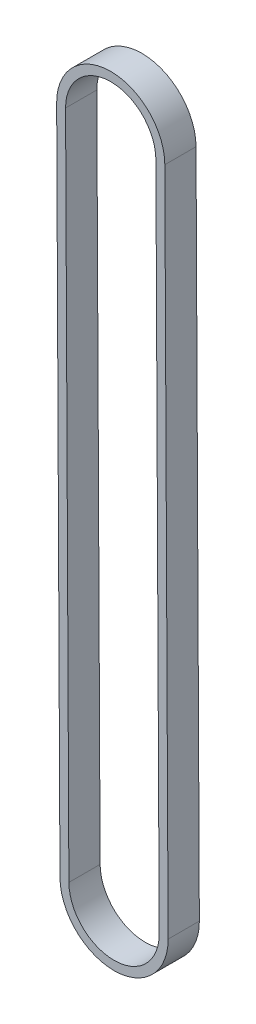
ISO-10303-21;
HEADER;
FILE_DESCRIPTION(('STEP AP214'),'2;1');
FILE_NAME('part.step','',(''),(''),'','','');
FILE_SCHEMA(('AUTOMOTIVE_DESIGN { 1 0 10303 214 1 1 1 1 }'));
ENDSEC;
DATA;
#1=APPLICATION_CONTEXT('core data for automotive mechanical design processes');
#2=APPLICATION_PROTOCOL_DEFINITION('international standard','automotive_design',2000,#1);
#3=PRODUCT_CONTEXT('',#1,'mechanical');
#4=PRODUCT('Part','Part','',(#3));
#5=PRODUCT_RELATED_PRODUCT_CATEGORY('part','',(#4));
#6=PRODUCT_DEFINITION_FORMATION('','',#4);
#7=PRODUCT_DEFINITION_CONTEXT('part definition',#1,'design');
#8=PRODUCT_DEFINITION('design','',#6,#7);
#9=PRODUCT_DEFINITION_SHAPE('','',#8);
#10=(LENGTH_UNIT() NAMED_UNIT(*) SI_UNIT(.MILLI.,.METRE.));
#11=(NAMED_UNIT(*) PLANE_ANGLE_UNIT() SI_UNIT($,.RADIAN.));
#12=(NAMED_UNIT(*) SI_UNIT($,.STERADIAN.) SOLID_ANGLE_UNIT());
#13=UNCERTAINTY_MEASURE_WITH_UNIT(LENGTH_MEASURE(1.E-05),#10,'distance_accuracy_value','');
#14=(GEOMETRIC_REPRESENTATION_CONTEXT(3) GLOBAL_UNCERTAINTY_ASSIGNED_CONTEXT((#13)) GLOBAL_UNIT_ASSIGNED_CONTEXT((#10,
#11,#12)) REPRESENTATION_CONTEXT('',''));
#15=CARTESIAN_POINT('',(0.,0.,0.));
#16=DIRECTION('',(0.,0.,1.));
#17=DIRECTION('',(1.,0.,0.));
#18=AXIS2_PLACEMENT_3D('',#15,#16,#17);
#19=CARTESIAN_POINT('',(-3.01494940124769E-12,0.,3.5));
#20=DIRECTION('',(0.,0.,-1.));
#21=DIRECTION('',(-1.,0.,0.));
#22=AXIS2_PLACEMENT_3D('',#19,#20,#21);
#23=PLANE('',#22);
#24=CARTESIAN_POINT('',(-3.01494940124769E-12,0.,3.5));
#25=DIRECTION('',(0.,0.,-1.));
#26=DIRECTION('',(-1.,0.,0.));
#27=AXIS2_PLACEMENT_3D('',#24,#25,#26);
#28=CIRCLE('',#27,12.125);
#29=CARTESIAN_POINT('',(-12.1248505328568,-0.0602042851909806,3.5));
#30=VERTEX_POINT('',#29);
#31=CARTESIAN_POINT('',(12.1248505328508,0.0602042851910733,3.5));
#32=VERTEX_POINT('',#31);
#33=EDGE_CURVE('E159',#30,#32,#28,.F.);
#34=ORIENTED_EDGE('',*,*,#33,.T.);
#35=DIRECTION('',(-0.00496530187142567,0.999987672812683,0.));
#36=VECTOR('',#35,1.);
#37=CARTESIAN_POINT('',(12.1248505328508,0.0602042851910917,3.5));
#38=LINE('',#37,#36);
#39=CARTESIAN_POINT('',(11.3800552521369,150.058355207094,3.5));
#40=VERTEX_POINT('',#39);
#41=EDGE_CURVE('E162',#32,#40,#38,.T.);
#42=ORIENTED_EDGE('',*,*,#41,.T.);
#43=CARTESIAN_POINT('',(-0.744795280716865,149.998150921903,3.5));
#44=DIRECTION('',(0.,0.,-1.));
#45=DIRECTION('',(-1.,0.,0.));
#46=AXIS2_PLACEMENT_3D('',#43,#44,#45);
#47=CIRCLE('',#46,12.125);
#48=CARTESIAN_POINT('',(-12.8696458135707,149.937946636712,3.5));
#49=VERTEX_POINT('',#48);
#50=EDGE_CURVE('E165',#40,#49,#47,.F.);
#51=ORIENTED_EDGE('',*,*,#50,.T.);
#52=DIRECTION('',(0.00496530187142567,-0.999987672812683,0.));
#53=VECTOR('',#52,1.);
#54=CARTESIAN_POINT('',(-12.1248505328568,-0.0602042851909807,3.5));
#55=LINE('',#54,#53);
#56=EDGE_CURVE('E167',#49,#30,#55,.T.);
#57=ORIENTED_EDGE('',*,*,#56,.T.);
#58=EDGE_LOOP('',(#34,#42,#51,#57));
#59=FACE_BOUND('',#58,.T.);
#60=CARTESIAN_POINT('',(-3.01494940124769E-12,0.,3.5));
#61=DIRECTION('',(0.,0.,1.));
#62=DIRECTION('',(-1.,0.,0.));
#63=AXIS2_PLACEMENT_3D('',#60,#61,#62);
#64=CIRCLE('',#63,10.125);
#65=CARTESIAN_POINT('',(-10.1248751872314,-0.0502736814481293,3.5));
#66=VERTEX_POINT('',#65);
#67=CARTESIAN_POINT('',(10.1248751872254,0.0502736814482403,3.5));
#68=VERTEX_POINT('',#67);
#69=EDGE_CURVE('E123',#66,#68,#64,.T.);
#70=ORIENTED_EDGE('',*,*,#69,.F.);
#71=DIRECTION('',(0.00496530187142567,-0.999987672812683,0.));
#72=VECTOR('',#71,1.);
#73=CARTESIAN_POINT('',(-10.1248751872314,-0.0502736814481293,3.5));
#74=LINE('',#73,#72);
#75=CARTESIAN_POINT('',(-10.8696704679453,149.947877240455,3.5));
#76=VERTEX_POINT('',#75);
#77=EDGE_CURVE('E145',#76,#66,#74,.T.);
#78=ORIENTED_EDGE('',*,*,#77,.F.);
#79=CARTESIAN_POINT('',(-0.744795280716865,149.998150921903,3.5));
#80=DIRECTION('',(0.,0.,1.));
#81=DIRECTION('',(-1.,0.,0.));
#82=AXIS2_PLACEMENT_3D('',#79,#80,#81);
#83=CIRCLE('',#82,10.125);
#84=CARTESIAN_POINT('',(9.38007990651155,150.048424603351,3.5));
#85=VERTEX_POINT('',#84);
#86=EDGE_CURVE('E143',#85,#76,#83,.T.);
#87=ORIENTED_EDGE('',*,*,#86,.F.);
#88=DIRECTION('',(-0.00496530187142567,0.999987672812683,0.));
#89=VECTOR('',#88,1.);
#90=CARTESIAN_POINT('',(9.38007990651155,150.048424603351,3.5));
#91=LINE('',#90,#89);
#92=EDGE_CURVE('E131',#68,#85,#91,.T.);
#93=ORIENTED_EDGE('',*,*,#92,.F.);
#94=EDGE_LOOP('',(#70,#78,#87,#93));
#95=FACE_BOUND('',#94,.T.);
#96=ADVANCED_FACE('F58',(#59,#95),#23,.F.);
#97=CARTESIAN_POINT('',(-3.01494940124769E-12,0.,-3.5));
#98=DIRECTION('',(0.,0.,-1.));
#99=DIRECTION('',(-1.,0.,0.));
#100=AXIS2_PLACEMENT_3D('',#97,#98,#99);
#101=PLANE('',#100);
#102=CARTESIAN_POINT('',(-3.01494940124769E-12,0.,-3.5));
#103=DIRECTION('',(0.,0.,-1.));
#104=DIRECTION('',(-1.,0.,0.));
#105=AXIS2_PLACEMENT_3D('',#102,#103,#104);
#106=CIRCLE('',#105,12.125);
#107=CARTESIAN_POINT('',(-12.1248505328568,-0.0602042851909806,-3.5));
#108=VERTEX_POINT('',#107);
#109=CARTESIAN_POINT('',(12.1248505328508,0.0602042851910733,-3.5));
#110=VERTEX_POINT('',#109);
#111=EDGE_CURVE('E139',#108,#110,#106,.F.);
#112=ORIENTED_EDGE('',*,*,#111,.F.);
#113=DIRECTION('',(0.00496530187142567,-0.999987672812683,0.));
#114=VECTOR('',#113,1.);
#115=CARTESIAN_POINT('',(-12.1248505328568,-0.0602042851909807,-3.5));
#116=LINE('',#115,#114);
#117=CARTESIAN_POINT('',(-12.8696458135707,149.937946636712,-3.5));
#118=VERTEX_POINT('',#117);
#119=EDGE_CURVE('E163',#118,#108,#116,.T.);
#120=ORIENTED_EDGE('',*,*,#119,.F.);
#121=CARTESIAN_POINT('',(-0.744795280716865,149.998150921903,-3.5));
#122=DIRECTION('',(0.,0.,-1.));
#123=DIRECTION('',(-1.,0.,0.));
#124=AXIS2_PLACEMENT_3D('',#121,#122,#123);
#125=CIRCLE('',#124,12.125);
#126=CARTESIAN_POINT('',(11.3800552521369,150.058355207094,-3.5));
#127=VERTEX_POINT('',#126);
#128=EDGE_CURVE('E174',#127,#118,#125,.F.);
#129=ORIENTED_EDGE('',*,*,#128,.F.);
#130=DIRECTION('',(-0.00496530187142567,0.999987672812683,0.));
#131=VECTOR('',#130,1.);
#132=CARTESIAN_POINT('',(12.1248505328508,0.0602042851910917,-3.5));
#133=LINE('',#132,#131);
#134=EDGE_CURVE('E172',#110,#127,#133,.T.);
#135=ORIENTED_EDGE('',*,*,#134,.F.);
#136=EDGE_LOOP('',(#112,#120,#129,#135));
#137=FACE_BOUND('',#136,.T.);
#138=DIRECTION('',(0.00496530187142567,-0.999987672812683,0.));
#139=VECTOR('',#138,1.);
#140=CARTESIAN_POINT('',(-10.1248751872314,-0.0502736814481293,-3.5));
#141=LINE('',#140,#139);
#142=CARTESIAN_POINT('',(-10.8696704679453,149.947877240455,-3.5));
#143=VERTEX_POINT('',#142);
#144=CARTESIAN_POINT('',(-10.1248751872314,-0.0502736814481293,-3.5));
#145=VERTEX_POINT('',#144);
#146=EDGE_CURVE('E132',#143,#145,#141,.T.);
#147=ORIENTED_EDGE('',*,*,#146,.T.);
#148=CARTESIAN_POINT('',(-3.01494940124769E-12,0.,-3.5));
#149=DIRECTION('',(0.,0.,1.));
#150=DIRECTION('',(-1.,0.,0.));
#151=AXIS2_PLACEMENT_3D('',#148,#149,#150);
#152=CIRCLE('',#151,10.125);
#153=CARTESIAN_POINT('',(10.1248751872254,0.0502736814482403,-3.5));
#154=VERTEX_POINT('',#153);
#155=EDGE_CURVE('E81',#145,#154,#152,.T.);
#156=ORIENTED_EDGE('',*,*,#155,.T.);
#157=DIRECTION('',(-0.00496530187142567,0.999987672812683,0.));
#158=VECTOR('',#157,1.);
#159=CARTESIAN_POINT('',(9.38007990651155,150.048424603351,-3.5));
#160=LINE('',#159,#158);
#161=CARTESIAN_POINT('',(9.38007990651155,150.048424603351,-3.5));
#162=VERTEX_POINT('',#161);
#163=EDGE_CURVE('E138',#154,#162,#160,.T.);
#164=ORIENTED_EDGE('',*,*,#163,.T.);
#165=CARTESIAN_POINT('',(-0.744795280716865,149.998150921903,-3.5));
#166=DIRECTION('',(0.,0.,1.));
#167=DIRECTION('',(-1.,0.,0.));
#168=AXIS2_PLACEMENT_3D('',#165,#166,#167);
#169=CIRCLE('',#168,10.125);
#170=EDGE_CURVE('E151',#162,#143,#169,.T.);
#171=ORIENTED_EDGE('',*,*,#170,.T.);
#172=EDGE_LOOP('',(#147,#156,#164,#171));
#173=FACE_BOUND('',#172,.T.);
#174=ADVANCED_FACE('F192',(#137,#173),#101,.T.);
#175=CARTESIAN_POINT('',(-3.01494940124769E-12,0.,3.5));
#176=DIRECTION('',(0.,0.,-1.));
#177=DIRECTION('',(-1.,0.,0.));
#178=AXIS2_PLACEMENT_3D('',#175,#176,#177);
#179=CYLINDRICAL_SURFACE('',#178,12.125);
#180=ORIENTED_EDGE('',*,*,#111,.T.);
#181=DIRECTION('',(0.,0.,-1.));
#182=VECTOR('',#181,1.);
#183=CARTESIAN_POINT('',(12.1248505328508,0.0602042851910733,3.5));
#184=LINE('',#183,#182);
#185=EDGE_CURVE('E12',#32,#110,#184,.T.);
#186=ORIENTED_EDGE('',*,*,#185,.F.);
#187=ORIENTED_EDGE('',*,*,#33,.F.);
#188=DIRECTION('',(0.,0.,-1.));
#189=VECTOR('',#188,1.);
#190=CARTESIAN_POINT('',(-12.1248505328568,-0.0602042851909806,3.5));
#191=LINE('',#190,#189);
#192=EDGE_CURVE('E169',#30,#108,#191,.T.);
#193=ORIENTED_EDGE('',*,*,#192,.T.);
#194=EDGE_LOOP('',(#180,#186,#187,#193));
#195=FACE_BOUND('',#194,.T.);
#196=ADVANCED_FACE('F60',(#195),#179,.T.);
#197=CARTESIAN_POINT('',(12.1248505328508,0.0602042851910917,3.5));
#198=DIRECTION('',(-0.999987672812683,-0.00496530187142567,0.));
#199=DIRECTION('',(0.00496530187142567,-0.999987672812683,0.));
#200=AXIS2_PLACEMENT_3D('',#197,#198,#199);
#201=PLANE('',#200);
#202=ORIENTED_EDGE('',*,*,#134,.T.);
#203=DIRECTION('',(0.,0.,-1.));
#204=VECTOR('',#203,1.);
#205=CARTESIAN_POINT('',(11.3800552521369,150.058355207094,3.5));
#206=LINE('',#205,#204);
#207=EDGE_CURVE('E66',#40,#127,#206,.T.);
#208=ORIENTED_EDGE('',*,*,#207,.F.);
#209=ORIENTED_EDGE('',*,*,#41,.F.);
#210=ORIENTED_EDGE('',*,*,#185,.T.);
#211=EDGE_LOOP('',(#202,#208,#209,#210));
#212=FACE_BOUND('',#211,.T.);
#213=ADVANCED_FACE('F202',(#212),#201,.F.);
#214=CARTESIAN_POINT('',(-0.744795280716865,149.998150921903,3.5));
#215=DIRECTION('',(0.,0.,-1.));
#216=DIRECTION('',(-1.,0.,0.));
#217=AXIS2_PLACEMENT_3D('',#214,#215,#216);
#218=CYLINDRICAL_SURFACE('',#217,12.125);
#219=ORIENTED_EDGE('',*,*,#128,.T.);
#220=DIRECTION('',(0.,0.,-1.));
#221=VECTOR('',#220,1.);
#222=CARTESIAN_POINT('',(-12.8696458135707,149.937946636712,3.5));
#223=LINE('',#222,#221);
#224=EDGE_CURVE('E179',#49,#118,#223,.T.);
#225=ORIENTED_EDGE('',*,*,#224,.F.);
#226=ORIENTED_EDGE('',*,*,#50,.F.);
#227=ORIENTED_EDGE('',*,*,#207,.T.);
#228=EDGE_LOOP('',(#219,#225,#226,#227));
#229=FACE_BOUND('',#228,.T.);
#230=ADVANCED_FACE('F186',(#229),#218,.T.);
#231=CARTESIAN_POINT('',(-12.1248505328568,-0.0602042851909807,3.5));
#232=DIRECTION('',(0.999987672812683,0.00496530187142567,0.));
#233=DIRECTION('',(-0.00496530187142567,0.999987672812683,0.));
#234=AXIS2_PLACEMENT_3D('',#231,#232,#233);
#235=PLANE('',#234);
#236=ORIENTED_EDGE('',*,*,#119,.T.);
#237=ORIENTED_EDGE('',*,*,#192,.F.);
#238=ORIENTED_EDGE('',*,*,#56,.F.);
#239=ORIENTED_EDGE('',*,*,#224,.T.);
#240=EDGE_LOOP('',(#236,#237,#238,#239));
#241=FACE_BOUND('',#240,.T.);
#242=ADVANCED_FACE('F196',(#241),#235,.F.);
#243=CARTESIAN_POINT('',(-3.01494940124769E-12,0.,3.5));
#244=DIRECTION('',(0.,0.,-1.));
#245=DIRECTION('',(-1.,0.,0.));
#246=AXIS2_PLACEMENT_3D('',#243,#244,#245);
#247=CYLINDRICAL_SURFACE('',#246,10.125);
#248=ORIENTED_EDGE('',*,*,#155,.F.);
#249=DIRECTION('',(0.,0.,-1.));
#250=VECTOR('',#249,1.);
#251=CARTESIAN_POINT('',(-10.1248751872314,-0.0502736814481293,3.5));
#252=LINE('',#251,#250);
#253=EDGE_CURVE('E127',#66,#145,#252,.T.);
#254=ORIENTED_EDGE('',*,*,#253,.F.);
#255=ORIENTED_EDGE('',*,*,#69,.T.);
#256=DIRECTION('',(0.,0.,-1.));
#257=VECTOR('',#256,1.);
#258=CARTESIAN_POINT('',(10.1248751872254,0.0502736814482403,3.5));
#259=LINE('',#258,#257);
#260=EDGE_CURVE('E126',#68,#154,#259,.T.);
#261=ORIENTED_EDGE('',*,*,#260,.T.);
#262=EDGE_LOOP('',(#248,#254,#255,#261));
#263=FACE_BOUND('',#262,.T.);
#264=ADVANCED_FACE('F125',(#263),#247,.F.);
#265=CARTESIAN_POINT('',(9.38007990651155,150.048424603351,3.5));
#266=DIRECTION('',(-0.999987672812683,-0.00496530187142567,0.));
#267=DIRECTION('',(0.00496530187142567,-0.999987672812683,0.));
#268=AXIS2_PLACEMENT_3D('',#265,#266,#267);
#269=PLANE('',#268);
#270=ORIENTED_EDGE('',*,*,#163,.F.);
#271=ORIENTED_EDGE('',*,*,#260,.F.);
#272=ORIENTED_EDGE('',*,*,#92,.T.);
#273=DIRECTION('',(0.,0.,-1.));
#274=VECTOR('',#273,1.);
#275=CARTESIAN_POINT('',(9.38007990651155,150.048424603351,3.5));
#276=LINE('',#275,#274);
#277=EDGE_CURVE('E140',#85,#162,#276,.T.);
#278=ORIENTED_EDGE('',*,*,#277,.T.);
#279=EDGE_LOOP('',(#270,#271,#272,#278));
#280=FACE_BOUND('',#279,.T.);
#281=ADVANCED_FACE('F135',(#280),#269,.T.);
#282=CARTESIAN_POINT('',(-0.744795280716865,149.998150921903,3.5));
#283=DIRECTION('',(0.,0.,-1.));
#284=DIRECTION('',(-1.,0.,0.));
#285=AXIS2_PLACEMENT_3D('',#282,#283,#284);
#286=CYLINDRICAL_SURFACE('',#285,10.125);
#287=ORIENTED_EDGE('',*,*,#170,.F.);
#288=ORIENTED_EDGE('',*,*,#277,.F.);
#289=ORIENTED_EDGE('',*,*,#86,.T.);
#290=DIRECTION('',(0.,0.,-1.));
#291=VECTOR('',#290,1.);
#292=CARTESIAN_POINT('',(-10.8696704679453,149.947877240455,3.5));
#293=LINE('',#292,#291);
#294=EDGE_CURVE('E73',#76,#143,#293,.T.);
#295=ORIENTED_EDGE('',*,*,#294,.T.);
#296=EDGE_LOOP('',(#287,#288,#289,#295));
#297=FACE_BOUND('',#296,.T.);
#298=ADVANCED_FACE('F225',(#297),#286,.F.);
#299=CARTESIAN_POINT('',(-10.1248751872314,-0.0502736814481293,3.5));
#300=DIRECTION('',(0.999987672812683,0.00496530187142567,0.));
#301=DIRECTION('',(-0.00496530187142567,0.999987672812683,0.));
#302=AXIS2_PLACEMENT_3D('',#299,#300,#301);
#303=PLANE('',#302);
#304=ORIENTED_EDGE('',*,*,#146,.F.);
#305=ORIENTED_EDGE('',*,*,#294,.F.);
#306=ORIENTED_EDGE('',*,*,#77,.T.);
#307=ORIENTED_EDGE('',*,*,#253,.T.);
#308=EDGE_LOOP('',(#304,#305,#306,#307));
#309=FACE_BOUND('',#308,.T.);
#310=ADVANCED_FACE('F229',(#309),#303,.T.);
#311=CLOSED_SHELL('',(#96,#174,#196,#213,#230,#242,#264,#281,#298,#310));
#312=MANIFOLD_SOLID_BREP('B2',#311);
#313=ADVANCED_BREP_SHAPE_REPRESENTATION('',(#18,#312),#14);
#314=SHAPE_DEFINITION_REPRESENTATION(#9,#313);
ENDSEC;
END-ISO-10303-21;
